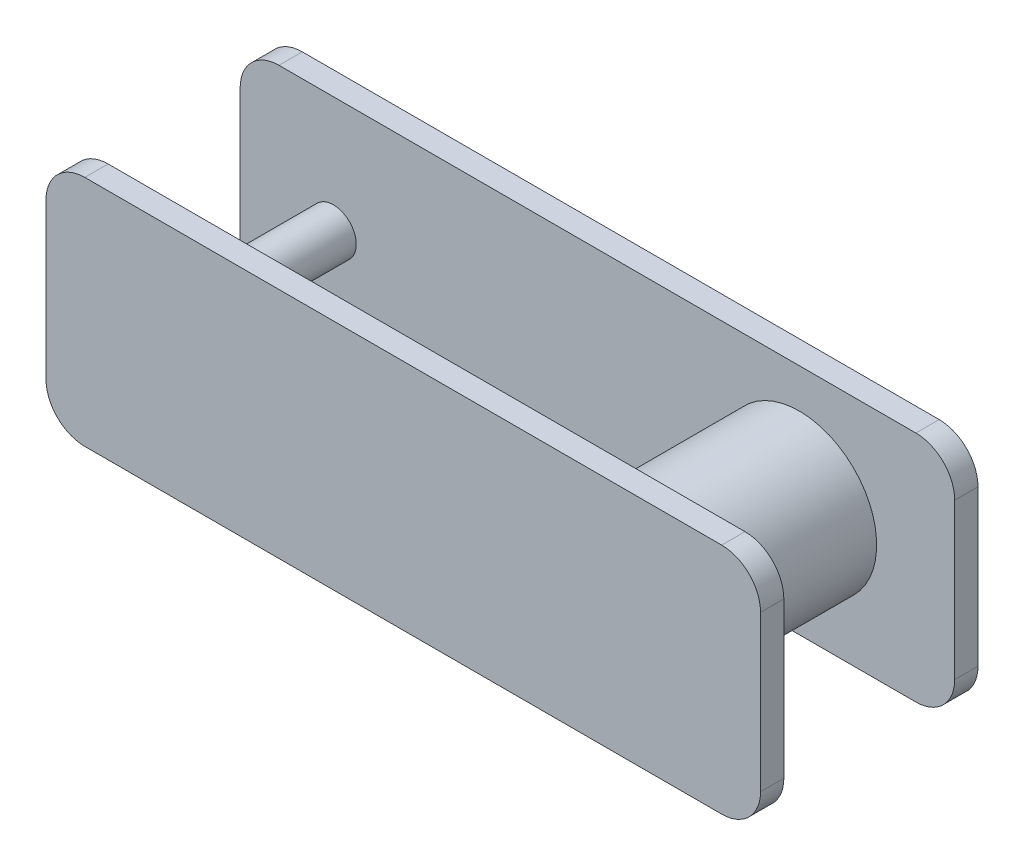
ISO-10303-21;
HEADER;
FILE_DESCRIPTION(('STEP AP214'),'2;1');
FILE_NAME('part.step','',(''),(''),'','','');
FILE_SCHEMA(('AUTOMOTIVE_DESIGN { 1 0 10303 214 1 1 1 1 }'));
ENDSEC;
DATA;
#1=APPLICATION_CONTEXT('core data for automotive mechanical design processes');
#2=APPLICATION_PROTOCOL_DEFINITION('international standard','automotive_design',2000,#1);
#3=PRODUCT_CONTEXT('',#1,'mechanical');
#4=PRODUCT('Part','Part','',(#3));
#5=PRODUCT_RELATED_PRODUCT_CATEGORY('part','',(#4));
#6=PRODUCT_DEFINITION_FORMATION('','',#4);
#7=PRODUCT_DEFINITION_CONTEXT('part definition',#1,'design');
#8=PRODUCT_DEFINITION('design','',#6,#7);
#9=PRODUCT_DEFINITION_SHAPE('','',#8);
#10=(LENGTH_UNIT() NAMED_UNIT(*) SI_UNIT(.MILLI.,.METRE.));
#11=(NAMED_UNIT(*) PLANE_ANGLE_UNIT() SI_UNIT($,.RADIAN.));
#12=(NAMED_UNIT(*) SI_UNIT($,.STERADIAN.) SOLID_ANGLE_UNIT());
#13=UNCERTAINTY_MEASURE_WITH_UNIT(LENGTH_MEASURE(1.E-05),#10,'distance_accuracy_value','');
#14=(GEOMETRIC_REPRESENTATION_CONTEXT(3) GLOBAL_UNCERTAINTY_ASSIGNED_CONTEXT((#13)) GLOBAL_UNIT_ASSIGNED_CONTEXT((#10,
#11,#12)) REPRESENTATION_CONTEXT('',''));
#15=CARTESIAN_POINT('',(0.,0.,0.));
#16=DIRECTION('',(0.,0.,1.));
#17=DIRECTION('',(1.,0.,0.));
#18=AXIS2_PLACEMENT_3D('',#15,#16,#17);
#19=CARTESIAN_POINT('',(75.,10.,3.));
#20=DIRECTION('',(0.,0.,-1.));
#21=DIRECTION('',(-1.,0.,0.));
#22=AXIS2_PLACEMENT_3D('',#19,#20,#21);
#23=CYLINDRICAL_SURFACE('',#22,5.);
#24=CARTESIAN_POINT('',(75.,10.,0.));
#25=DIRECTION('',(0.,0.,1.));
#26=DIRECTION('',(-1.,0.,0.));
#27=AXIS2_PLACEMENT_3D('',#24,#25,#26);
#28=CIRCLE('',#27,5.);
#29=CARTESIAN_POINT('',(80.,9.99999999999996,0.));
#30=VERTEX_POINT('',#29);
#31=CARTESIAN_POINT('',(75.,15.,0.));
#32=VERTEX_POINT('',#31);
#33=EDGE_CURVE('E151',#30,#32,#28,.T.);
#34=ORIENTED_EDGE('',*,*,#33,.T.);
#35=DIRECTION('',(0.,0.,-1.));
#36=VECTOR('',#35,1.);
#37=CARTESIAN_POINT('',(75.,15.,3.));
#38=LINE('',#37,#36);
#39=CARTESIAN_POINT('',(75.,15.,3.));
#40=VERTEX_POINT('',#39);
#41=EDGE_CURVE('E193',#40,#32,#38,.T.);
#42=ORIENTED_EDGE('',*,*,#41,.F.);
#43=CARTESIAN_POINT('',(75.,10.,3.));
#44=DIRECTION('',(0.,0.,1.));
#45=DIRECTION('',(-1.,0.,0.));
#46=AXIS2_PLACEMENT_3D('',#43,#44,#45);
#47=CIRCLE('',#46,5.);
#48=CARTESIAN_POINT('',(80.,9.99999999999996,3.));
#49=VERTEX_POINT('',#48);
#50=EDGE_CURVE('E174',#49,#40,#47,.T.);
#51=ORIENTED_EDGE('',*,*,#50,.F.);
#52=DIRECTION('',(0.,0.,-1.));
#53=VECTOR('',#52,1.);
#54=CARTESIAN_POINT('',(80.,9.99999999999996,3.));
#55=LINE('',#54,#53);
#56=EDGE_CURVE('E147',#49,#30,#55,.T.);
#57=ORIENTED_EDGE('',*,*,#56,.T.);
#58=EDGE_LOOP('',(#34,#42,#51,#57));
#59=FACE_BOUND('',#58,.T.);
#60=ADVANCED_FACE('F45',(#59),#23,.T.);
#61=CARTESIAN_POINT('',(-6.99999999999997,15.,3.));
#62=DIRECTION('',(0.,-1.,0.));
#63=DIRECTION('',(0.,0.,-1.));
#64=AXIS2_PLACEMENT_3D('',#61,#62,#63);
#65=PLANE('',#64);
#66=DIRECTION('',(-1.,0.,0.));
#67=VECTOR('',#66,1.);
#68=CARTESIAN_POINT('',(-6.99999999999997,15.,0.));
#69=LINE('',#68,#67);
#70=CARTESIAN_POINT('',(-6.99999999999997,15.,0.));
#71=VERTEX_POINT('',#70);
#72=EDGE_CURVE('E155',#32,#71,#69,.T.);
#73=ORIENTED_EDGE('',*,*,#72,.T.);
#74=DIRECTION('',(0.,0.,-1.));
#75=VECTOR('',#74,1.);
#76=CARTESIAN_POINT('',(-6.99999999999997,15.,3.));
#77=LINE('',#76,#75);
#78=CARTESIAN_POINT('',(-6.99999999999997,15.,3.));
#79=VERTEX_POINT('',#78);
#80=EDGE_CURVE('E189',#79,#71,#77,.T.);
#81=ORIENTED_EDGE('',*,*,#80,.F.);
#82=DIRECTION('',(-1.,0.,0.));
#83=VECTOR('',#82,1.);
#84=CARTESIAN_POINT('',(-6.99999999999997,15.,3.));
#85=LINE('',#84,#83);
#86=EDGE_CURVE('E107',#40,#79,#85,.T.);
#87=ORIENTED_EDGE('',*,*,#86,.F.);
#88=ORIENTED_EDGE('',*,*,#41,.T.);
#89=EDGE_LOOP('',(#73,#81,#87,#88));
#90=FACE_BOUND('',#89,.T.);
#91=ADVANCED_FACE('F217',(#90),#65,.F.);
#92=CARTESIAN_POINT('',(-7.,10.,3.));
#93=DIRECTION('',(0.,0.,-1.));
#94=DIRECTION('',(-1.,0.,0.));
#95=AXIS2_PLACEMENT_3D('',#92,#93,#94);
#96=CYLINDRICAL_SURFACE('',#95,5.);
#97=CARTESIAN_POINT('',(-7.,10.,0.));
#98=DIRECTION('',(0.,0.,1.));
#99=DIRECTION('',(1.,0.,0.));
#100=AXIS2_PLACEMENT_3D('',#97,#98,#99);
#101=CIRCLE('',#100,5.);
#102=CARTESIAN_POINT('',(-12.,9.99999999999997,0.));
#103=VERTEX_POINT('',#102);
#104=EDGE_CURVE('E159',#71,#103,#101,.T.);
#105=ORIENTED_EDGE('',*,*,#104,.T.);
#106=DIRECTION('',(0.,0.,-1.));
#107=VECTOR('',#106,1.);
#108=CARTESIAN_POINT('',(-12.,9.99999999999997,3.));
#109=LINE('',#108,#107);
#110=CARTESIAN_POINT('',(-12.,9.99999999999997,3.));
#111=VERTEX_POINT('',#110);
#112=EDGE_CURVE('E185',#111,#103,#109,.T.);
#113=ORIENTED_EDGE('',*,*,#112,.F.);
#114=CARTESIAN_POINT('',(-7.,10.,3.));
#115=DIRECTION('',(0.,0.,1.));
#116=DIRECTION('',(1.,0.,0.));
#117=AXIS2_PLACEMENT_3D('',#114,#115,#116);
#118=CIRCLE('',#117,5.);
#119=EDGE_CURVE('E231',#79,#111,#118,.T.);
#120=ORIENTED_EDGE('',*,*,#119,.F.);
#121=ORIENTED_EDGE('',*,*,#80,.T.);
#122=EDGE_LOOP('',(#105,#113,#120,#121));
#123=FACE_BOUND('',#122,.T.);
#124=ADVANCED_FACE('F222',(#123),#96,.T.);
#125=CARTESIAN_POINT('',(-12.,9.99999999999996,3.));
#126=DIRECTION('',(1.,0.,0.));
#127=DIRECTION('',(0.,1.,0.));
#128=AXIS2_PLACEMENT_3D('',#125,#126,#127);
#129=PLANE('',#128);
#130=DIRECTION('',(0.,-1.,0.));
#131=VECTOR('',#130,1.);
#132=CARTESIAN_POINT('',(-12.,9.99999999999996,0.));
#133=LINE('',#132,#131);
#134=CARTESIAN_POINT('',(-12.,-9.99999999999996,0.));
#135=VERTEX_POINT('',#134);
#136=EDGE_CURVE('E162',#103,#135,#133,.T.);
#137=ORIENTED_EDGE('',*,*,#136,.T.);
#138=DIRECTION('',(0.,0.,-1.));
#139=VECTOR('',#138,1.);
#140=CARTESIAN_POINT('',(-12.,-9.99999999999996,3.));
#141=LINE('',#140,#139);
#142=CARTESIAN_POINT('',(-12.,-9.99999999999996,3.));
#143=VERTEX_POINT('',#142);
#144=EDGE_CURVE('E181',#143,#135,#141,.T.);
#145=ORIENTED_EDGE('',*,*,#144,.F.);
#146=DIRECTION('',(0.,-1.,0.));
#147=VECTOR('',#146,1.);
#148=CARTESIAN_POINT('',(-12.,9.99999999999996,3.));
#149=LINE('',#148,#147);
#150=EDGE_CURVE('E234',#111,#143,#149,.T.);
#151=ORIENTED_EDGE('',*,*,#150,.F.);
#152=ORIENTED_EDGE('',*,*,#112,.T.);
#153=EDGE_LOOP('',(#137,#145,#151,#152));
#154=FACE_BOUND('',#153,.T.);
#155=ADVANCED_FACE('F530',(#154),#129,.F.);
#156=CARTESIAN_POINT('',(-7.,-10.,3.));
#157=DIRECTION('',(0.,0.,-1.));
#158=DIRECTION('',(-1.,0.,0.));
#159=AXIS2_PLACEMENT_3D('',#156,#157,#158);
#160=CYLINDRICAL_SURFACE('',#159,5.);
#161=CARTESIAN_POINT('',(-7.,-10.,0.));
#162=DIRECTION('',(0.,0.,1.));
#163=DIRECTION('',(1.,0.,0.));
#164=AXIS2_PLACEMENT_3D('',#161,#162,#163);
#165=CIRCLE('',#164,5.);
#166=CARTESIAN_POINT('',(-6.99999999999996,-15.,0.));
#167=VERTEX_POINT('',#166);
#168=EDGE_CURVE('E165',#135,#167,#165,.T.);
#169=ORIENTED_EDGE('',*,*,#168,.T.);
#170=DIRECTION('',(0.,0.,-1.));
#171=VECTOR('',#170,1.);
#172=CARTESIAN_POINT('',(-6.99999999999996,-15.,3.));
#173=LINE('',#172,#171);
#174=CARTESIAN_POINT('',(-6.99999999999996,-15.,3.));
#175=VERTEX_POINT('',#174);
#176=EDGE_CURVE('E140',#175,#167,#173,.T.);
#177=ORIENTED_EDGE('',*,*,#176,.F.);
#178=CARTESIAN_POINT('',(-7.,-10.,3.));
#179=DIRECTION('',(0.,0.,1.));
#180=DIRECTION('',(1.,0.,0.));
#181=AXIS2_PLACEMENT_3D('',#178,#179,#180);
#182=CIRCLE('',#181,5.);
#183=EDGE_CURVE('E129',#143,#175,#182,.T.);
#184=ORIENTED_EDGE('',*,*,#183,.F.);
#185=ORIENTED_EDGE('',*,*,#144,.T.);
#186=EDGE_LOOP('',(#169,#177,#184,#185));
#187=FACE_BOUND('',#186,.T.);
#188=ADVANCED_FACE('F522',(#187),#160,.T.);
#189=CARTESIAN_POINT('',(-6.99999999999996,-15.,3.));
#190=DIRECTION('',(0.,1.,0.));
#191=DIRECTION('',(0.,0.,1.));
#192=AXIS2_PLACEMENT_3D('',#189,#190,#191);
#193=PLANE('',#192);
#194=DIRECTION('',(1.,0.,0.));
#195=VECTOR('',#194,1.);
#196=CARTESIAN_POINT('',(-6.99999999999996,-15.,0.));
#197=LINE('',#196,#195);
#198=CARTESIAN_POINT('',(75.,-15.,0.));
#199=VERTEX_POINT('',#198);
#200=EDGE_CURVE('E138',#167,#199,#197,.T.);
#201=ORIENTED_EDGE('',*,*,#200,.T.);
#202=DIRECTION('',(0.,0.,-1.));
#203=VECTOR('',#202,1.);
#204=CARTESIAN_POINT('',(75.,-15.,3.));
#205=LINE('',#204,#203);
#206=CARTESIAN_POINT('',(75.,-15.,3.));
#207=VERTEX_POINT('',#206);
#208=EDGE_CURVE('E135',#207,#199,#205,.T.);
#209=ORIENTED_EDGE('',*,*,#208,.F.);
#210=DIRECTION('',(1.,0.,0.));
#211=VECTOR('',#210,1.);
#212=CARTESIAN_POINT('',(-6.99999999999996,-15.,3.));
#213=LINE('',#212,#211);
#214=EDGE_CURVE('E123',#175,#207,#213,.T.);
#215=ORIENTED_EDGE('',*,*,#214,.F.);
#216=ORIENTED_EDGE('',*,*,#176,.T.);
#217=EDGE_LOOP('',(#201,#209,#215,#216));
#218=FACE_BOUND('',#217,.T.);
#219=ADVANCED_FACE('F136',(#218),#193,.F.);
#220=CARTESIAN_POINT('',(75.,-10.,3.));
#221=DIRECTION('',(0.,0.,-1.));
#222=DIRECTION('',(-1.,0.,0.));
#223=AXIS2_PLACEMENT_3D('',#220,#221,#222);
#224=CYLINDRICAL_SURFACE('',#223,5.);
#225=CARTESIAN_POINT('',(75.,-10.,0.));
#226=DIRECTION('',(0.,0.,1.));
#227=DIRECTION('',(1.,0.,0.));
#228=AXIS2_PLACEMENT_3D('',#225,#226,#227);
#229=CIRCLE('',#228,5.);
#230=CARTESIAN_POINT('',(80.,-10.,0.));
#231=VERTEX_POINT('',#230);
#232=EDGE_CURVE('E92',#199,#231,#229,.T.);
#233=ORIENTED_EDGE('',*,*,#232,.T.);
#234=DIRECTION('',(0.,0.,-1.));
#235=VECTOR('',#234,1.);
#236=CARTESIAN_POINT('',(80.,-10.,3.));
#237=LINE('',#236,#235);
#238=CARTESIAN_POINT('',(80.,-10.,3.));
#239=VERTEX_POINT('',#238);
#240=EDGE_CURVE('E141',#239,#231,#237,.T.);
#241=ORIENTED_EDGE('',*,*,#240,.F.);
#242=CARTESIAN_POINT('',(75.,-10.,3.));
#243=DIRECTION('',(0.,0.,1.));
#244=DIRECTION('',(1.,0.,0.));
#245=AXIS2_PLACEMENT_3D('',#242,#243,#244);
#246=CIRCLE('',#245,5.);
#247=EDGE_CURVE('E127',#207,#239,#246,.T.);
#248=ORIENTED_EDGE('',*,*,#247,.F.);
#249=ORIENTED_EDGE('',*,*,#208,.T.);
#250=EDGE_LOOP('',(#233,#241,#248,#249));
#251=FACE_BOUND('',#250,.T.);
#252=ADVANCED_FACE('F143',(#251),#224,.T.);
#253=CARTESIAN_POINT('',(80.,9.99999999999996,3.));
#254=DIRECTION('',(-1.,0.,0.));
#255=DIRECTION('',(0.,0.,1.));
#256=AXIS2_PLACEMENT_3D('',#253,#254,#255);
#257=PLANE('',#256);
#258=DIRECTION('',(0.,1.,0.));
#259=VECTOR('',#258,1.);
#260=CARTESIAN_POINT('',(80.,9.99999999999996,0.));
#261=LINE('',#260,#259);
#262=EDGE_CURVE('E98',#231,#30,#261,.T.);
#263=ORIENTED_EDGE('',*,*,#262,.T.);
#264=ORIENTED_EDGE('',*,*,#56,.F.);
#265=DIRECTION('',(0.,1.,0.));
#266=VECTOR('',#265,1.);
#267=CARTESIAN_POINT('',(80.,9.99999999999996,3.));
#268=LINE('',#267,#266);
#269=EDGE_CURVE('E62',#239,#49,#268,.T.);
#270=ORIENTED_EDGE('',*,*,#269,.F.);
#271=ORIENTED_EDGE('',*,*,#240,.T.);
#272=EDGE_LOOP('',(#263,#264,#270,#271));
#273=FACE_BOUND('',#272,.T.);
#274=ADVANCED_FACE('F203',(#273),#257,.F.);
#275=CARTESIAN_POINT('',(75.,10.,3.));
#276=DIRECTION('',(0.,0.,-1.));
#277=DIRECTION('',(-1.,0.,0.));
#278=AXIS2_PLACEMENT_3D('',#275,#276,#277);
#279=PLANE('',#278);
#280=CARTESIAN_POINT('',(60.,0.,3.));
#281=DIRECTION('',(0.,0.,-1.));
#282=DIRECTION('',(-1.,0.,0.));
#283=AXIS2_PLACEMENT_3D('',#280,#281,#282);
#284=CIRCLE('',#283,9.95);
#285=CARTESIAN_POINT('',(50.05,0.,3.));
#286=VERTEX_POINT('',#285);
#287=EDGE_CURVE('E11',#286,#286,#284,.F.);
#288=ORIENTED_EDGE('',*,*,#287,.F.);
#289=EDGE_LOOP('',(#288));
#290=FACE_BOUND('',#289,.T.);
#291=CARTESIAN_POINT('',(0.,0.,3.));
#292=DIRECTION('',(0.,0.,-1.));
#293=DIRECTION('',(-1.,0.,0.));
#294=AXIS2_PLACEMENT_3D('',#291,#292,#293);
#295=CIRCLE('',#294,2.95);
#296=CARTESIAN_POINT('',(-2.95,0.,3.));
#297=VERTEX_POINT('',#296);
#298=EDGE_CURVE('E54',#297,#297,#295,.F.);
#299=ORIENTED_EDGE('',*,*,#298,.F.);
#300=EDGE_LOOP('',(#299));
#301=FACE_BOUND('',#300,.T.);
#302=ORIENTED_EDGE('',*,*,#50,.T.);
#303=ORIENTED_EDGE('',*,*,#86,.T.);
#304=ORIENTED_EDGE('',*,*,#119,.T.);
#305=ORIENTED_EDGE('',*,*,#150,.T.);
#306=ORIENTED_EDGE('',*,*,#183,.T.);
#307=ORIENTED_EDGE('',*,*,#214,.T.);
#308=ORIENTED_EDGE('',*,*,#247,.T.);
#309=ORIENTED_EDGE('',*,*,#269,.T.);
#310=EDGE_LOOP('',(#302,#303,#304,#305,#306,#307,#308,#309));
#311=FACE_BOUND('',#310,.T.);
#312=ADVANCED_FACE('F125',(#290,#301,#311),#279,.F.);
#313=CARTESIAN_POINT('',(75.,10.,0.));
#314=DIRECTION('',(0.,0.,-1.));
#315=DIRECTION('',(-1.,0.,0.));
#316=AXIS2_PLACEMENT_3D('',#313,#314,#315);
#317=PLANE('',#316);
#318=ORIENTED_EDGE('',*,*,#33,.F.);
#319=ORIENTED_EDGE('',*,*,#262,.F.);
#320=ORIENTED_EDGE('',*,*,#232,.F.);
#321=ORIENTED_EDGE('',*,*,#200,.F.);
#322=ORIENTED_EDGE('',*,*,#168,.F.);
#323=ORIENTED_EDGE('',*,*,#136,.F.);
#324=ORIENTED_EDGE('',*,*,#104,.F.);
#325=ORIENTED_EDGE('',*,*,#72,.F.);
#326=EDGE_LOOP('',(#318,#319,#320,#321,#322,#323,#324,#325));
#327=FACE_BOUND('',#326,.T.);
#328=ADVANCED_FACE('F202',(#327),#317,.T.);
#329=CARTESIAN_POINT('',(0.,0.,25.));
#330=DIRECTION('',(0.,0.,-1.));
#331=DIRECTION('',(-1.,0.,0.));
#332=AXIS2_PLACEMENT_3D('',#329,#330,#331);
#333=CYLINDRICAL_SURFACE('',#332,2.95);
#334=CARTESIAN_POINT('',(0.,0.,25.));
#335=DIRECTION('',(0.,0.,1.));
#336=DIRECTION('',(1.,0.,0.));
#337=AXIS2_PLACEMENT_3D('',#334,#335,#336);
#338=CIRCLE('',#337,2.95);
#339=CARTESIAN_POINT('',(2.95,0.,25.));
#340=VERTEX_POINT('',#339);
#341=EDGE_CURVE('E156',#340,#340,#338,.T.);
#342=ORIENTED_EDGE('',*,*,#341,.F.);
#343=EDGE_LOOP('',(#342));
#344=FACE_BOUND('',#343,.T.);
#345=ORIENTED_EDGE('',*,*,#298,.T.);
#346=EDGE_LOOP('',(#345));
#347=FACE_BOUND('',#346,.T.);
#348=ADVANCED_FACE('F199',(#344,#347),#333,.T.);
#349=CARTESIAN_POINT('',(60.,0.,25.));
#350=DIRECTION('',(0.,0.,-1.));
#351=DIRECTION('',(-1.,0.,0.));
#352=AXIS2_PLACEMENT_3D('',#349,#350,#351);
#353=CYLINDRICAL_SURFACE('',#352,9.95);
#354=CARTESIAN_POINT('',(60.,0.,25.));
#355=DIRECTION('',(0.,0.,1.));
#356=DIRECTION('',(1.,0.,0.));
#357=AXIS2_PLACEMENT_3D('',#354,#355,#356);
#358=CIRCLE('',#357,9.95);
#359=CARTESIAN_POINT('',(69.95,0.,25.));
#360=VERTEX_POINT('',#359);
#361=EDGE_CURVE('E247',#360,#360,#358,.T.);
#362=ORIENTED_EDGE('',*,*,#361,.F.);
#363=EDGE_LOOP('',(#362));
#364=FACE_BOUND('',#363,.T.);
#365=ORIENTED_EDGE('',*,*,#287,.T.);
#366=EDGE_LOOP('',(#365));
#367=FACE_BOUND('',#366,.T.);
#368=ADVANCED_FACE('F421',(#364,#367),#353,.T.);
#369=CARTESIAN_POINT('',(75.,10.,28.));
#370=DIRECTION('',(0.,0.,-1.));
#371=DIRECTION('',(-1.,0.,0.));
#372=AXIS2_PLACEMENT_3D('',#369,#370,#371);
#373=CYLINDRICAL_SURFACE('',#372,5.);
#374=CARTESIAN_POINT('',(75.,10.,25.));
#375=DIRECTION('',(0.,0.,1.));
#376=DIRECTION('',(1.,0.,0.));
#377=AXIS2_PLACEMENT_3D('',#374,#375,#376);
#378=CIRCLE('',#377,5.);
#379=CARTESIAN_POINT('',(80.,9.99999999999997,25.));
#380=VERTEX_POINT('',#379);
#381=CARTESIAN_POINT('',(75.,15.,25.));
#382=VERTEX_POINT('',#381);
#383=EDGE_CURVE('E313',#380,#382,#378,.T.);
#384=ORIENTED_EDGE('',*,*,#383,.T.);
#385=DIRECTION('',(0.,0.,-1.));
#386=VECTOR('',#385,1.);
#387=CARTESIAN_POINT('',(75.,15.,28.));
#388=LINE('',#387,#386);
#389=CARTESIAN_POINT('',(75.,15.,28.));
#390=VERTEX_POINT('',#389);
#391=EDGE_CURVE('E251',#390,#382,#388,.T.);
#392=ORIENTED_EDGE('',*,*,#391,.F.);
#393=CARTESIAN_POINT('',(75.,10.,28.));
#394=DIRECTION('',(0.,0.,1.));
#395=DIRECTION('',(1.,0.,0.));
#396=AXIS2_PLACEMENT_3D('',#393,#394,#395);
#397=CIRCLE('',#396,5.);
#398=CARTESIAN_POINT('',(80.,9.99999999999997,28.));
#399=VERTEX_POINT('',#398);
#400=EDGE_CURVE('E288',#399,#390,#397,.T.);
#401=ORIENTED_EDGE('',*,*,#400,.F.);
#402=DIRECTION('',(0.,0.,-1.));
#403=VECTOR('',#402,1.);
#404=CARTESIAN_POINT('',(80.,9.99999999999997,28.));
#405=LINE('',#404,#403);
#406=EDGE_CURVE('E279',#399,#380,#405,.T.);
#407=ORIENTED_EDGE('',*,*,#406,.T.);
#408=EDGE_LOOP('',(#384,#392,#401,#407));
#409=FACE_BOUND('',#408,.T.);
#410=ADVANCED_FACE('F358',(#409),#373,.T.);
#411=CARTESIAN_POINT('',(75.,15.,28.));
#412=DIRECTION('',(0.,-1.,0.));
#413=DIRECTION('',(1.,0.,0.));
#414=AXIS2_PLACEMENT_3D('',#411,#412,#413);
#415=PLANE('',#414);
#416=DIRECTION('',(-1.,0.,0.));
#417=VECTOR('',#416,1.);
#418=CARTESIAN_POINT('',(75.,15.,25.));
#419=LINE('',#418,#417);
#420=CARTESIAN_POINT('',(-6.99999999999997,15.,25.));
#421=VERTEX_POINT('',#420);
#422=EDGE_CURVE('E309',#382,#421,#419,.T.);
#423=ORIENTED_EDGE('',*,*,#422,.T.);
#424=DIRECTION('',(0.,0.,-1.));
#425=VECTOR('',#424,1.);
#426=CARTESIAN_POINT('',(-6.99999999999997,15.,28.));
#427=LINE('',#426,#425);
#428=CARTESIAN_POINT('',(-6.99999999999997,15.,28.));
#429=VERTEX_POINT('',#428);
#430=EDGE_CURVE('E255',#429,#421,#427,.T.);
#431=ORIENTED_EDGE('',*,*,#430,.F.);
#432=DIRECTION('',(-1.,0.,0.));
#433=VECTOR('',#432,1.);
#434=CARTESIAN_POINT('',(75.,15.,28.));
#435=LINE('',#434,#433);
#436=EDGE_CURVE('E340',#390,#429,#435,.T.);
#437=ORIENTED_EDGE('',*,*,#436,.F.);
#438=ORIENTED_EDGE('',*,*,#391,.T.);
#439=EDGE_LOOP('',(#423,#431,#437,#438));
#440=FACE_BOUND('',#439,.T.);
#441=ADVANCED_FACE('F362',(#440),#415,.F.);
#442=CARTESIAN_POINT('',(-7.,10.,28.));
#443=DIRECTION('',(0.,0.,-1.));
#444=DIRECTION('',(-1.,0.,0.));
#445=AXIS2_PLACEMENT_3D('',#442,#443,#444);
#446=CYLINDRICAL_SURFACE('',#445,5.);
#447=CARTESIAN_POINT('',(-7.,10.,25.));
#448=DIRECTION('',(0.,0.,1.));
#449=DIRECTION('',(1.,0.,0.));
#450=AXIS2_PLACEMENT_3D('',#447,#448,#449);
#451=CIRCLE('',#450,5.);
#452=CARTESIAN_POINT('',(-12.,9.99999999999997,25.));
#453=VERTEX_POINT('',#452);
#454=EDGE_CURVE('E305',#421,#453,#451,.T.);
#455=ORIENTED_EDGE('',*,*,#454,.T.);
#456=DIRECTION('',(0.,0.,-1.));
#457=VECTOR('',#456,1.);
#458=CARTESIAN_POINT('',(-12.,9.99999999999997,28.));
#459=LINE('',#458,#457);
#460=CARTESIAN_POINT('',(-12.,9.99999999999997,28.));
#461=VERTEX_POINT('',#460);
#462=EDGE_CURVE('E259',#461,#453,#459,.T.);
#463=ORIENTED_EDGE('',*,*,#462,.F.);
#464=CARTESIAN_POINT('',(-7.,10.,28.));
#465=DIRECTION('',(0.,0.,1.));
#466=DIRECTION('',(1.,0.,0.));
#467=AXIS2_PLACEMENT_3D('',#464,#465,#466);
#468=CIRCLE('',#467,5.);
#469=EDGE_CURVE('E336',#429,#461,#468,.T.);
#470=ORIENTED_EDGE('',*,*,#469,.F.);
#471=ORIENTED_EDGE('',*,*,#430,.T.);
#472=EDGE_LOOP('',(#455,#463,#470,#471));
#473=FACE_BOUND('',#472,.T.);
#474=ADVANCED_FACE('F412',(#473),#446,.T.);
#475=CARTESIAN_POINT('',(-12.,9.99999999999997,28.));
#476=DIRECTION('',(1.,0.,0.));
#477=DIRECTION('',(0.,1.,0.));
#478=AXIS2_PLACEMENT_3D('',#475,#476,#477);
#479=PLANE('',#478);
#480=DIRECTION('',(0.,-1.,0.));
#481=VECTOR('',#480,1.);
#482=CARTESIAN_POINT('',(-12.,9.99999999999997,25.));
#483=LINE('',#482,#481);
#484=CARTESIAN_POINT('',(-12.,-9.99999999999996,25.));
#485=VERTEX_POINT('',#484);
#486=EDGE_CURVE('E301',#453,#485,#483,.T.);
#487=ORIENTED_EDGE('',*,*,#486,.T.);
#488=DIRECTION('',(0.,0.,-1.));
#489=VECTOR('',#488,1.);
#490=CARTESIAN_POINT('',(-12.,-9.99999999999996,28.));
#491=LINE('',#490,#489);
#492=CARTESIAN_POINT('',(-12.,-9.99999999999996,28.));
#493=VERTEX_POINT('',#492);
#494=EDGE_CURVE('E263',#493,#485,#491,.T.);
#495=ORIENTED_EDGE('',*,*,#494,.F.);
#496=DIRECTION('',(0.,-1.,0.));
#497=VECTOR('',#496,1.);
#498=CARTESIAN_POINT('',(-12.,9.99999999999997,28.));
#499=LINE('',#498,#497);
#500=EDGE_CURVE('E332',#461,#493,#499,.T.);
#501=ORIENTED_EDGE('',*,*,#500,.F.);
#502=ORIENTED_EDGE('',*,*,#462,.T.);
#503=EDGE_LOOP('',(#487,#495,#501,#502));
#504=FACE_BOUND('',#503,.T.);
#505=ADVANCED_FACE('F408',(#504),#479,.F.);
#506=CARTESIAN_POINT('',(-7.,-10.,28.));
#507=DIRECTION('',(0.,0.,-1.));
#508=DIRECTION('',(-1.,0.,0.));
#509=AXIS2_PLACEMENT_3D('',#506,#507,#508);
#510=CYLINDRICAL_SURFACE('',#509,5.);
#511=CARTESIAN_POINT('',(-7.,-10.,25.));
#512=DIRECTION('',(0.,0.,1.));
#513=DIRECTION('',(1.,0.,0.));
#514=AXIS2_PLACEMENT_3D('',#511,#512,#513);
#515=CIRCLE('',#514,5.);
#516=CARTESIAN_POINT('',(-6.99999999999996,-15.,25.));
#517=VERTEX_POINT('',#516);
#518=EDGE_CURVE('E297',#485,#517,#515,.T.);
#519=ORIENTED_EDGE('',*,*,#518,.T.);
#520=DIRECTION('',(0.,0.,-1.));
#521=VECTOR('',#520,1.);
#522=CARTESIAN_POINT('',(-6.99999999999996,-15.,28.));
#523=LINE('',#522,#521);
#524=CARTESIAN_POINT('',(-6.99999999999996,-15.,28.));
#525=VERTEX_POINT('',#524);
#526=EDGE_CURVE('E267',#525,#517,#523,.T.);
#527=ORIENTED_EDGE('',*,*,#526,.F.);
#528=CARTESIAN_POINT('',(-7.,-10.,28.));
#529=DIRECTION('',(0.,0.,1.));
#530=DIRECTION('',(1.,0.,0.));
#531=AXIS2_PLACEMENT_3D('',#528,#529,#530);
#532=CIRCLE('',#531,5.);
#533=EDGE_CURVE('E328',#493,#525,#532,.T.);
#534=ORIENTED_EDGE('',*,*,#533,.F.);
#535=ORIENTED_EDGE('',*,*,#494,.T.);
#536=EDGE_LOOP('',(#519,#527,#534,#535));
#537=FACE_BOUND('',#536,.T.);
#538=ADVANCED_FACE('F404',(#537),#510,.T.);
#539=CARTESIAN_POINT('',(-6.99999999999996,-15.,28.));
#540=DIRECTION('',(0.,1.,0.));
#541=DIRECTION('',(0.,0.,1.));
#542=AXIS2_PLACEMENT_3D('',#539,#540,#541);
#543=PLANE('',#542);
#544=DIRECTION('',(1.,0.,0.));
#545=VECTOR('',#544,1.);
#546=CARTESIAN_POINT('',(-6.99999999999996,-15.,25.));
#547=LINE('',#546,#545);
#548=CARTESIAN_POINT('',(75.,-15.,25.));
#549=VERTEX_POINT('',#548);
#550=EDGE_CURVE('E293',#517,#549,#547,.T.);
#551=ORIENTED_EDGE('',*,*,#550,.T.);
#552=DIRECTION('',(0.,0.,-1.));
#553=VECTOR('',#552,1.);
#554=CARTESIAN_POINT('',(75.,-15.,28.));
#555=LINE('',#554,#553);
#556=CARTESIAN_POINT('',(75.,-15.,28.));
#557=VERTEX_POINT('',#556);
#558=EDGE_CURVE('E271',#557,#549,#555,.T.);
#559=ORIENTED_EDGE('',*,*,#558,.F.);
#560=DIRECTION('',(1.,0.,0.));
#561=VECTOR('',#560,1.);
#562=CARTESIAN_POINT('',(-6.99999999999996,-15.,28.));
#563=LINE('',#562,#561);
#564=EDGE_CURVE('E324',#525,#557,#563,.T.);
#565=ORIENTED_EDGE('',*,*,#564,.F.);
#566=ORIENTED_EDGE('',*,*,#526,.T.);
#567=EDGE_LOOP('',(#551,#559,#565,#566));
#568=FACE_BOUND('',#567,.T.);
#569=ADVANCED_FACE('F401',(#568),#543,.F.);
#570=CARTESIAN_POINT('',(75.,-10.,28.));
#571=DIRECTION('',(0.,0.,-1.));
#572=DIRECTION('',(-1.,0.,0.));
#573=AXIS2_PLACEMENT_3D('',#570,#571,#572);
#574=CYLINDRICAL_SURFACE('',#573,5.);
#575=CARTESIAN_POINT('',(75.,-10.,25.));
#576=DIRECTION('',(0.,0.,1.));
#577=DIRECTION('',(1.,0.,0.));
#578=AXIS2_PLACEMENT_3D('',#575,#576,#577);
#579=CIRCLE('',#578,5.);
#580=CARTESIAN_POINT('',(80.,-10.,25.));
#581=VERTEX_POINT('',#580);
#582=EDGE_CURVE('E289',#549,#581,#579,.T.);
#583=ORIENTED_EDGE('',*,*,#582,.T.);
#584=DIRECTION('',(0.,0.,-1.));
#585=VECTOR('',#584,1.);
#586=CARTESIAN_POINT('',(80.,-10.,28.));
#587=LINE('',#586,#585);
#588=CARTESIAN_POINT('',(80.,-10.,28.));
#589=VERTEX_POINT('',#588);
#590=EDGE_CURVE('E275',#589,#581,#587,.T.);
#591=ORIENTED_EDGE('',*,*,#590,.F.);
#592=CARTESIAN_POINT('',(75.,-10.,28.));
#593=DIRECTION('',(0.,0.,1.));
#594=DIRECTION('',(1.,0.,0.));
#595=AXIS2_PLACEMENT_3D('',#592,#593,#594);
#596=CIRCLE('',#595,5.);
#597=EDGE_CURVE('E320',#557,#589,#596,.T.);
#598=ORIENTED_EDGE('',*,*,#597,.F.);
#599=ORIENTED_EDGE('',*,*,#558,.T.);
#600=EDGE_LOOP('',(#583,#591,#598,#599));
#601=FACE_BOUND('',#600,.T.);
#602=ADVANCED_FACE('F398',(#601),#574,.T.);
#603=CARTESIAN_POINT('',(80.,-10.,28.));
#604=DIRECTION('',(-1.,0.,0.));
#605=DIRECTION('',(0.,0.,1.));
#606=AXIS2_PLACEMENT_3D('',#603,#604,#605);
#607=PLANE('',#606);
#608=DIRECTION('',(0.,1.,0.));
#609=VECTOR('',#608,1.);
#610=CARTESIAN_POINT('',(80.,-10.,25.));
#611=LINE('',#610,#609);
#612=EDGE_CURVE('E284',#581,#380,#611,.T.);
#613=ORIENTED_EDGE('',*,*,#612,.T.);
#614=ORIENTED_EDGE('',*,*,#406,.F.);
#615=DIRECTION('',(0.,1.,0.));
#616=VECTOR('',#615,1.);
#617=CARTESIAN_POINT('',(80.,-10.,28.));
#618=LINE('',#617,#616);
#619=EDGE_CURVE('E283',#589,#399,#618,.T.);
#620=ORIENTED_EDGE('',*,*,#619,.F.);
#621=ORIENTED_EDGE('',*,*,#590,.T.);
#622=EDGE_LOOP('',(#613,#614,#620,#621));
#623=FACE_BOUND('',#622,.T.);
#624=ADVANCED_FACE('F385',(#623),#607,.F.);
#625=CARTESIAN_POINT('',(75.,10.,28.));
#626=DIRECTION('',(0.,0.,1.));
#627=DIRECTION('',(1.,0.,0.));
#628=AXIS2_PLACEMENT_3D('',#625,#626,#627);
#629=PLANE('',#628);
#630=ORIENTED_EDGE('',*,*,#400,.T.);
#631=ORIENTED_EDGE('',*,*,#436,.T.);
#632=ORIENTED_EDGE('',*,*,#469,.T.);
#633=ORIENTED_EDGE('',*,*,#500,.T.);
#634=ORIENTED_EDGE('',*,*,#533,.T.);
#635=ORIENTED_EDGE('',*,*,#564,.T.);
#636=ORIENTED_EDGE('',*,*,#597,.T.);
#637=ORIENTED_EDGE('',*,*,#619,.T.);
#638=EDGE_LOOP('',(#630,#631,#632,#633,#634,#635,#636,#637));
#639=FACE_BOUND('',#638,.T.);
#640=ADVANCED_FACE('F350',(#639),#629,.T.);
#641=CARTESIAN_POINT('',(75.,10.,25.));
#642=DIRECTION('',(0.,0.,1.));
#643=DIRECTION('',(1.,0.,0.));
#644=AXIS2_PLACEMENT_3D('',#641,#642,#643);
#645=PLANE('',#644);
#646=ORIENTED_EDGE('',*,*,#341,.T.);
#647=EDGE_LOOP('',(#646));
#648=FACE_BOUND('',#647,.T.);
#649=ORIENTED_EDGE('',*,*,#361,.T.);
#650=EDGE_LOOP('',(#649));
#651=FACE_BOUND('',#650,.T.);
#652=ORIENTED_EDGE('',*,*,#383,.F.);
#653=ORIENTED_EDGE('',*,*,#612,.F.);
#654=ORIENTED_EDGE('',*,*,#582,.F.);
#655=ORIENTED_EDGE('',*,*,#550,.F.);
#656=ORIENTED_EDGE('',*,*,#518,.F.);
#657=ORIENTED_EDGE('',*,*,#486,.F.);
#658=ORIENTED_EDGE('',*,*,#454,.F.);
#659=ORIENTED_EDGE('',*,*,#422,.F.);
#660=EDGE_LOOP('',(#652,#653,#654,#655,#656,#657,#658,#659));
#661=FACE_BOUND('',#660,.T.);
#662=ADVANCED_FACE('F386',(#648,#651,#661),#645,.F.);
#663=CLOSED_SHELL('',(#60,#91,#124,#155,#188,#219,#252,#274,#312,#328,#348,#368,#410,#441,#474,
#505,#538,#569,#602,#624,#640,#662));
#664=MANIFOLD_SOLID_BREP('B2',#663);
#665=ADVANCED_BREP_SHAPE_REPRESENTATION('',(#18,#664),#14);
#666=SHAPE_DEFINITION_REPRESENTATION(#9,#665);
ENDSEC;
END-ISO-10303-21;
